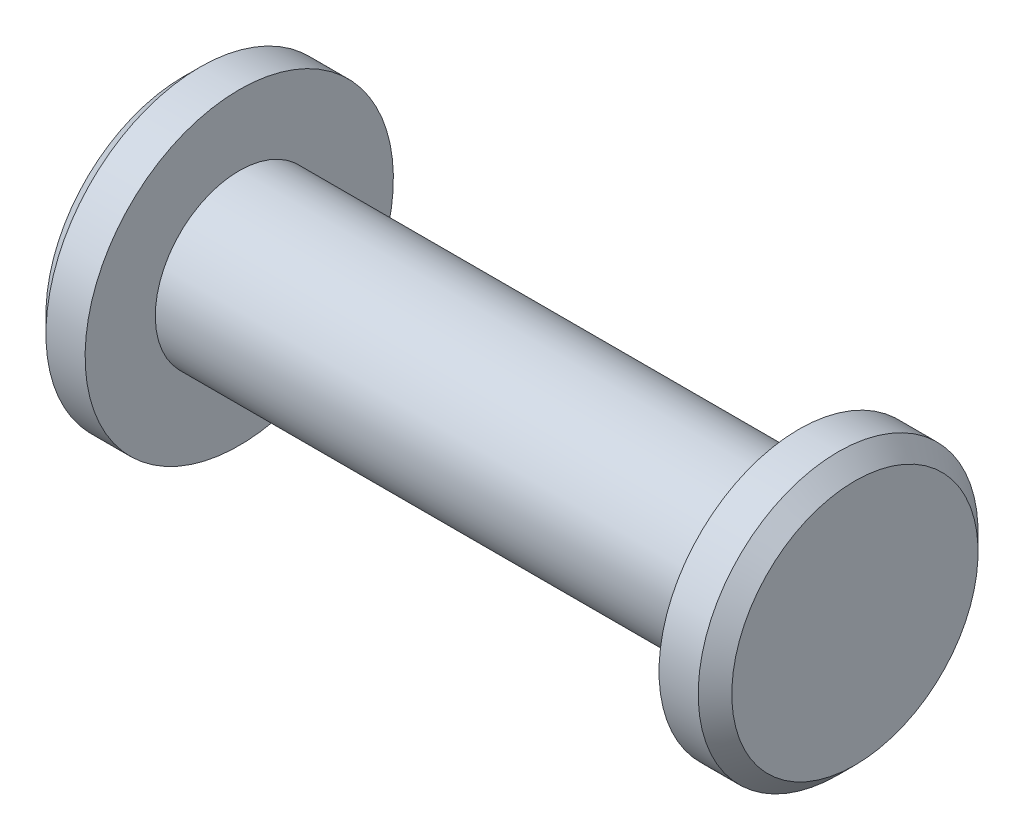
ISO-10303-21;
HEADER;
FILE_DESCRIPTION(('STEP AP214'),'2;1');
FILE_NAME('part.step','',(''),(''),'','','');
FILE_SCHEMA(('AUTOMOTIVE_DESIGN { 1 0 10303 214 1 1 1 1 }'));
ENDSEC;
DATA;
#1=APPLICATION_CONTEXT('core data for automotive mechanical design processes');
#2=APPLICATION_PROTOCOL_DEFINITION('international standard','automotive_design',2000,#1);
#3=PRODUCT_CONTEXT('',#1,'mechanical');
#4=PRODUCT('Part','Part','',(#3));
#5=PRODUCT_RELATED_PRODUCT_CATEGORY('part','',(#4));
#6=PRODUCT_DEFINITION_FORMATION('','',#4);
#7=PRODUCT_DEFINITION_CONTEXT('part definition',#1,'design');
#8=PRODUCT_DEFINITION('design','',#6,#7);
#9=PRODUCT_DEFINITION_SHAPE('','',#8);
#10=(LENGTH_UNIT() NAMED_UNIT(*) SI_UNIT(.MILLI.,.METRE.));
#11=(NAMED_UNIT(*) PLANE_ANGLE_UNIT() SI_UNIT($,.RADIAN.));
#12=(NAMED_UNIT(*) SI_UNIT($,.STERADIAN.) SOLID_ANGLE_UNIT());
#13=UNCERTAINTY_MEASURE_WITH_UNIT(LENGTH_MEASURE(1.E-05),#10,'distance_accuracy_value','');
#14=(GEOMETRIC_REPRESENTATION_CONTEXT(3) GLOBAL_UNCERTAINTY_ASSIGNED_CONTEXT((#13)) GLOBAL_UNIT_ASSIGNED_CONTEXT((#10,
#11,#12)) REPRESENTATION_CONTEXT('',''));
#15=CARTESIAN_POINT('',(0.,0.,0.));
#16=DIRECTION('',(0.,0.,1.));
#17=DIRECTION('',(1.,0.,0.));
#18=AXIS2_PLACEMENT_3D('',#15,#16,#17);
#19=CARTESIAN_POINT('',(0.,25.,0.));
#20=DIRECTION('',(1.,0.,0.));
#21=DIRECTION('',(0.,1.,0.));
#22=AXIS2_PLACEMENT_3D('',#19,#20,#21);
#23=PLANE('',#22);
#24=CARTESIAN_POINT('',(0.,0.,0.));
#25=DIRECTION('',(1.,0.,0.));
#26=DIRECTION('',(0.,1.,0.));
#27=AXIS2_PLACEMENT_3D('',#24,#25,#26);
#28=CIRCLE('',#27,22.);
#29=CARTESIAN_POINT('',(0.,-22.,0.));
#30=VERTEX_POINT('',#29);
#31=EDGE_CURVE('E52',#30,#30,#28,.T.);
#32=ORIENTED_EDGE('',*,*,#31,.T.);
#33=EDGE_LOOP('',(#32));
#34=FACE_BOUND('',#33,.T.);
#35=ADVANCED_FACE('F43',(#34),#23,.T.);
#36=CARTESIAN_POINT('',(-120.,0.,0.));
#37=DIRECTION('',(-1.,0.,0.));
#38=DIRECTION('',(0.,-1.,0.));
#39=AXIS2_PLACEMENT_3D('',#36,#37,#38);
#40=PLANE('',#39);
#41=CARTESIAN_POINT('',(-120.,0.,0.));
#42=DIRECTION('',(-1.,0.,0.));
#43=DIRECTION('',(0.,-1.,0.));
#44=AXIS2_PLACEMENT_3D('',#41,#42,#43);
#45=CIRCLE('',#44,24.5382262996941);
#46=CARTESIAN_POINT('',(-120.,-24.5382262996941,0.));
#47=VERTEX_POINT('',#46);
#48=EDGE_CURVE('E57',#47,#47,#45,.T.);
#49=ORIENTED_EDGE('',*,*,#48,.T.);
#50=EDGE_LOOP('',(#49));
#51=FACE_BOUND('',#50,.T.);
#52=ADVANCED_FACE('F102',(#51),#40,.T.);
#53=CARTESIAN_POINT('',(0.,0.,0.));
#54=DIRECTION('',(1.,0.,0.));
#55=DIRECTION('',(0.,1.,0.));
#56=AXIS2_PLACEMENT_3D('',#53,#54,#55);
#57=CYLINDRICAL_SURFACE('',#56,27.5382262996941);
#58=CARTESIAN_POINT('',(-117.,0.,0.));
#59=DIRECTION('',(-1.,0.,0.));
#60=DIRECTION('',(0.,-1.,0.));
#61=AXIS2_PLACEMENT_3D('',#58,#59,#60);
#62=CIRCLE('',#61,27.5382262996941);
#63=CARTESIAN_POINT('',(-117.,-27.5382262996942,0.));
#64=VERTEX_POINT('',#63);
#65=EDGE_CURVE('E62',#64,#64,#62,.F.);
#66=ORIENTED_EDGE('',*,*,#65,.T.);
#67=EDGE_LOOP('',(#66));
#68=FACE_BOUND('',#67,.T.);
#69=CARTESIAN_POINT('',(-110.,0.,0.));
#70=DIRECTION('',(1.,0.,0.));
#71=DIRECTION('',(0.,1.,0.));
#72=AXIS2_PLACEMENT_3D('',#69,#70,#71);
#73=CIRCLE('',#72,27.5382262996941);
#74=CARTESIAN_POINT('',(-110.,27.5382262996941,0.));
#75=VERTEX_POINT('',#74);
#76=EDGE_CURVE('E68',#75,#75,#73,.T.);
#77=ORIENTED_EDGE('',*,*,#76,.F.);
#78=EDGE_LOOP('',(#77));
#79=FACE_BOUND('',#78,.T.);
#80=ADVANCED_FACE('F107',(#68,#79),#57,.T.);
#81=CARTESIAN_POINT('',(-110.,27.5382262996941,0.));
#82=DIRECTION('',(1.,0.,0.));
#83=DIRECTION('',(0.,1.,0.));
#84=AXIS2_PLACEMENT_3D('',#81,#82,#83);
#85=PLANE('',#84);
#86=ORIENTED_EDGE('',*,*,#76,.T.);
#87=EDGE_LOOP('',(#86));
#88=FACE_BOUND('',#87,.T.);
#89=CARTESIAN_POINT('',(-110.,0.,0.));
#90=DIRECTION('',(1.,0.,0.));
#91=DIRECTION('',(0.,1.,0.));
#92=AXIS2_PLACEMENT_3D('',#89,#90,#91);
#93=CIRCLE('',#92,15.);
#94=CARTESIAN_POINT('',(-110.,15.,0.));
#95=VERTEX_POINT('',#94);
#96=EDGE_CURVE('E72',#95,#95,#93,.T.);
#97=ORIENTED_EDGE('',*,*,#96,.F.);
#98=EDGE_LOOP('',(#97));
#99=FACE_BOUND('',#98,.T.);
#100=ADVANCED_FACE('F98',(#88,#99),#85,.T.);
#101=CARTESIAN_POINT('',(0.,0.,0.));
#102=DIRECTION('',(1.,0.,0.));
#103=DIRECTION('',(0.,1.,0.));
#104=AXIS2_PLACEMENT_3D('',#101,#102,#103);
#105=CYLINDRICAL_SURFACE('',#104,15.);
#106=ORIENTED_EDGE('',*,*,#96,.T.);
#107=EDGE_LOOP('',(#106));
#108=FACE_BOUND('',#107,.T.);
#109=CARTESIAN_POINT('',(-9.99999999999999,0.,0.));
#110=DIRECTION('',(1.,0.,0.));
#111=DIRECTION('',(0.,1.,0.));
#112=AXIS2_PLACEMENT_3D('',#109,#110,#111);
#113=CIRCLE('',#112,15.);
#114=CARTESIAN_POINT('',(-9.99999999999999,15.,0.));
#115=VERTEX_POINT('',#114);
#116=EDGE_CURVE('E76',#115,#115,#113,.T.);
#117=ORIENTED_EDGE('',*,*,#116,.F.);
#118=EDGE_LOOP('',(#117));
#119=FACE_BOUND('',#118,.T.);
#120=ADVANCED_FACE('F89',(#108,#119),#105,.T.);
#121=CARTESIAN_POINT('',(-9.99999999999999,15.,0.));
#122=DIRECTION('',(-1.,0.,0.));
#123=DIRECTION('',(0.,-1.,0.));
#124=AXIS2_PLACEMENT_3D('',#121,#122,#123);
#125=PLANE('',#124);
#126=ORIENTED_EDGE('',*,*,#116,.T.);
#127=EDGE_LOOP('',(#126));
#128=FACE_BOUND('',#127,.T.);
#129=CARTESIAN_POINT('',(-9.99999999999999,0.,0.));
#130=DIRECTION('',(1.,0.,0.));
#131=DIRECTION('',(0.,1.,0.));
#132=AXIS2_PLACEMENT_3D('',#129,#130,#131);
#133=CIRCLE('',#132,25.);
#134=CARTESIAN_POINT('',(-10.,25.,0.));
#135=VERTEX_POINT('',#134);
#136=EDGE_CURVE('E80',#135,#135,#133,.T.);
#137=ORIENTED_EDGE('',*,*,#136,.F.);
#138=EDGE_LOOP('',(#137));
#139=FACE_BOUND('',#138,.T.);
#140=ADVANCED_FACE('F87',(#128,#139),#125,.T.);
#141=CARTESIAN_POINT('',(0.,0.,0.));
#142=DIRECTION('',(1.,0.,0.));
#143=DIRECTION('',(0.,1.,0.));
#144=AXIS2_PLACEMENT_3D('',#141,#142,#143);
#145=CYLINDRICAL_SURFACE('',#144,25.);
#146=CARTESIAN_POINT('',(-3.,0.,0.));
#147=DIRECTION('',(1.,0.,0.));
#148=DIRECTION('',(0.,1.,0.));
#149=AXIS2_PLACEMENT_3D('',#146,#147,#148);
#150=CIRCLE('',#149,25.);
#151=CARTESIAN_POINT('',(-3.,-25.,0.));
#152=VERTEX_POINT('',#151);
#153=EDGE_CURVE('E10',#152,#152,#150,.F.);
#154=ORIENTED_EDGE('',*,*,#153,.T.);
#155=EDGE_LOOP('',(#154));
#156=FACE_BOUND('',#155,.T.);
#157=ORIENTED_EDGE('',*,*,#136,.T.);
#158=EDGE_LOOP('',(#157));
#159=FACE_BOUND('',#158,.T.);
#160=ADVANCED_FACE('F85',(#156,#159),#145,.T.);
#161=CARTESIAN_POINT('',(-117.,0.,0.));
#162=DIRECTION('',(1.,0.,0.));
#163=DIRECTION('',(0.,1.,0.));
#164=AXIS2_PLACEMENT_3D('',#161,#162,#163);
#165=CONICAL_SURFACE('',#164,27.5382262996941,0.785398163397452);
#166=ORIENTED_EDGE('',*,*,#48,.F.);
#167=EDGE_LOOP('',(#166));
#168=FACE_BOUND('',#167,.T.);
#169=ORIENTED_EDGE('',*,*,#65,.F.);
#170=EDGE_LOOP('',(#169));
#171=FACE_BOUND('',#170,.T.);
#172=ADVANCED_FACE('F96',(#168,#171),#165,.T.);
#173=CARTESIAN_POINT('',(0.,0.,0.));
#174=DIRECTION('',(-1.,0.,0.));
#175=DIRECTION('',(0.,-1.,0.));
#176=AXIS2_PLACEMENT_3D('',#173,#174,#175);
#177=CONICAL_SURFACE('',#176,22.,0.78539816339745);
#178=CARTESIAN_POINT('',(-3.,-25.,0.));
#179=CARTESIAN_POINT('',(-2.96875,-24.96875,0.));
#180=CARTESIAN_POINT('',(-2.9375,-24.9375,0.));
#181=CARTESIAN_POINT('',(-2.875,-24.875,0.));
#182=CARTESIAN_POINT('',(-2.84375,-24.84375,0.));
#183=CARTESIAN_POINT('',(-2.78125,-24.78125,0.));
#184=CARTESIAN_POINT('',(-2.75,-24.75,0.));
#185=CARTESIAN_POINT('',(-2.6875,-24.6875,0.));
#186=CARTESIAN_POINT('',(-2.65625,-24.65625,0.));
#187=CARTESIAN_POINT('',(-2.59375,-24.59375,0.));
#188=CARTESIAN_POINT('',(-2.5625,-24.5625,0.));
#189=CARTESIAN_POINT('',(-2.5,-24.5,0.));
#190=CARTESIAN_POINT('',(-2.46875,-24.46875,0.));
#191=CARTESIAN_POINT('',(-2.40625,-24.40625,0.));
#192=CARTESIAN_POINT('',(-2.375,-24.375,0.));
#193=CARTESIAN_POINT('',(-2.3125,-24.3125,0.));
#194=CARTESIAN_POINT('',(-2.28125,-24.28125,0.));
#195=CARTESIAN_POINT('',(-2.21875,-24.21875,0.));
#196=CARTESIAN_POINT('',(-2.1875,-24.1875,0.));
#197=CARTESIAN_POINT('',(-2.125,-24.125,0.));
#198=CARTESIAN_POINT('',(-2.09375,-24.09375,0.));
#199=CARTESIAN_POINT('',(-2.03125,-24.03125,0.));
#200=CARTESIAN_POINT('',(-2.,-24.,0.));
#201=CARTESIAN_POINT('',(-1.9375,-23.9375,0.));
#202=CARTESIAN_POINT('',(-1.90625,-23.90625,0.));
#203=CARTESIAN_POINT('',(-1.84375,-23.84375,0.));
#204=CARTESIAN_POINT('',(-1.8125,-23.8125,0.));
#205=CARTESIAN_POINT('',(-1.75,-23.75,0.));
#206=CARTESIAN_POINT('',(-1.71875,-23.71875,0.));
#207=CARTESIAN_POINT('',(-1.65625,-23.65625,0.));
#208=CARTESIAN_POINT('',(-1.625,-23.625,0.));
#209=CARTESIAN_POINT('',(-1.5625,-23.5625,0.));
#210=CARTESIAN_POINT('',(-1.53125,-23.53125,0.));
#211=CARTESIAN_POINT('',(-1.46875,-23.46875,0.));
#212=CARTESIAN_POINT('',(-1.4375,-23.4375,0.));
#213=CARTESIAN_POINT('',(-1.375,-23.375,0.));
#214=CARTESIAN_POINT('',(-1.34375,-23.34375,0.));
#215=CARTESIAN_POINT('',(-1.28125,-23.28125,0.));
#216=CARTESIAN_POINT('',(-1.25,-23.25,0.));
#217=CARTESIAN_POINT('',(-1.1875,-23.1875,0.));
#218=CARTESIAN_POINT('',(-1.15625,-23.15625,0.));
#219=CARTESIAN_POINT('',(-1.09375,-23.09375,0.));
#220=CARTESIAN_POINT('',(-1.0625,-23.0625,0.));
#221=CARTESIAN_POINT('',(-0.999999999999997,-23.,0.));
#222=CARTESIAN_POINT('',(-0.968749999999996,-22.96875,0.));
#223=CARTESIAN_POINT('',(-0.906249999999996,-22.90625,0.));
#224=CARTESIAN_POINT('',(-0.874999999999996,-22.875,0.));
#225=CARTESIAN_POINT('',(-0.812499999999996,-22.8125,0.));
#226=CARTESIAN_POINT('',(-0.781249999999996,-22.78125,0.));
#227=CARTESIAN_POINT('',(-0.718749999999996,-22.71875,0.));
#228=CARTESIAN_POINT('',(-0.687499999999996,-22.6875,0.));
#229=CARTESIAN_POINT('',(-0.624999999999996,-22.625,0.));
#230=CARTESIAN_POINT('',(-0.593749999999996,-22.59375,0.));
#231=CARTESIAN_POINT('',(-0.531249999999995,-22.53125,0.));
#232=CARTESIAN_POINT('',(-0.499999999999995,-22.5,0.));
#233=CARTESIAN_POINT('',(-0.437499999999995,-22.4375,0.));
#234=CARTESIAN_POINT('',(-0.406249999999995,-22.40625,0.));
#235=CARTESIAN_POINT('',(-0.343749999999995,-22.34375,0.));
#236=CARTESIAN_POINT('',(-0.312499999999995,-22.3125,0.));
#237=CARTESIAN_POINT('',(-0.249999999999995,-22.25,0.));
#238=CARTESIAN_POINT('',(-0.218749999999995,-22.21875,0.));
#239=CARTESIAN_POINT('',(-0.156249999999995,-22.15625,0.));
#240=CARTESIAN_POINT('',(-0.124999999999995,-22.125,0.));
#241=CARTESIAN_POINT('',(-0.0624999999999943,-22.0625,0.));
#242=CARTESIAN_POINT('',(-0.0312499999999942,-22.03125,0.));
#243=CARTESIAN_POINT('',(0.,-22.,0.));
#244=B_SPLINE_CURVE_WITH_KNOTS('',3,(#178,#179,#180,#181,#182,#183,#184,#185,#186,#187,#188,
#189,#190,#191,#192,#193,#194,#195,#196,#197,#198,#199,#200,#201,#202,#203,#204,#205,#206,#207,
#208,#209,#210,#211,#212,#213,#214,#215,#216,#217,#218,#219,#220,#221,#222,#223,#224,#225,#226,
#227,#228,#229,#230,#231,#232,#233,#234,#235,#236,#237,#238,#239,#240,#241,#242,#243),
.UNSPECIFIED.,.F.,.F.,(4,2,2,2,2,2,2,2,2,2,2,2,2,2,2,2,2,2,2,2,2,2,2,2,2,2,2,2,2,2,2,2,4),(0.,
0.132582521472478,0.265165042944956,0.397747564417434,0.530330085889911,0.662912607362392,
0.79549512883487,0.928077650307348,1.06066017177983,1.1932426932523,1.32582521472478,
1.45840773619726,1.59099025766974,1.72357277914222,1.85615530061469,1.98873782208717,
2.12132034355965,2.25390286503213,2.38648538650461,2.51906790797708,2.65165042944956,
2.78423295092204,2.91681547239452,3.049397993867,3.18198051533948,3.31456303681195,
3.44714555828443,3.57972807975691,3.71231060122939,3.84489312270187,3.97747564417435,
4.11005816564682,4.2426406871193),.UNSPECIFIED.);
#245=EDGE_CURVE('BSEAM46',#152,#30,#244,.T.);
#246=ORIENTED_EDGE('',*,*,#153,.F.);
#247=ORIENTED_EDGE('',*,*,#31,.F.);
#248=ORIENTED_EDGE('',*,*,#245,.T.);
#249=ORIENTED_EDGE('',*,*,#245,.F.);
#250=EDGE_LOOP('',(#246,#248,#247,#249));
#251=FACE_BOUND('',#250,.T.);
#252=ADVANCED_FACE('F46',(#251),#177,.T.);
#253=CLOSED_SHELL('',(#35,#52,#80,#100,#120,#140,#160,#172,#252));
#254=MANIFOLD_SOLID_BREP('B2',#253);
#255=ADVANCED_BREP_SHAPE_REPRESENTATION('',(#18,#254),#14);
#256=SHAPE_DEFINITION_REPRESENTATION(#9,#255);
ENDSEC;
END-ISO-10303-21;
